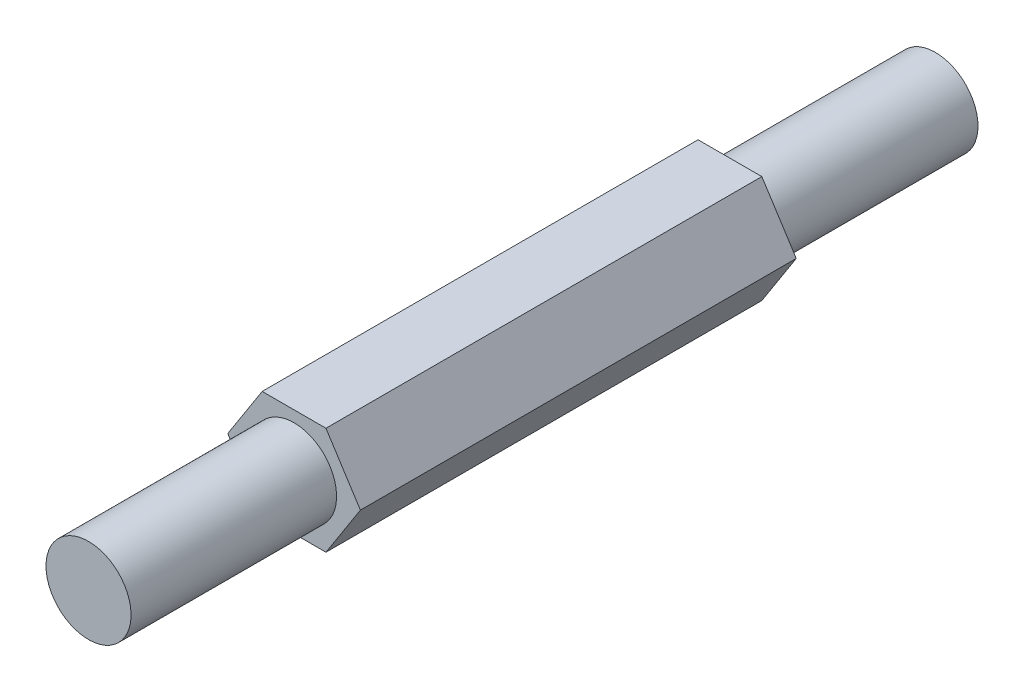
ISO-10303-21;
HEADER;
FILE_DESCRIPTION(('STEP AP214'),'2;1');
FILE_NAME('part.step','',(''),(''),'','','');
FILE_SCHEMA(('AUTOMOTIVE_DESIGN { 1 0 10303 214 1 1 1 1 }'));
ENDSEC;
DATA;
#1=APPLICATION_CONTEXT('core data for automotive mechanical design processes');
#2=APPLICATION_PROTOCOL_DEFINITION('international standard','automotive_design',2000,#1);
#3=PRODUCT_CONTEXT('',#1,'mechanical');
#4=PRODUCT('Part','Part','',(#3));
#5=PRODUCT_RELATED_PRODUCT_CATEGORY('part','',(#4));
#6=PRODUCT_DEFINITION_FORMATION('','',#4);
#7=PRODUCT_DEFINITION_CONTEXT('part definition',#1,'design');
#8=PRODUCT_DEFINITION('design','',#6,#7);
#9=PRODUCT_DEFINITION_SHAPE('','',#8);
#10=(LENGTH_UNIT() NAMED_UNIT(*) SI_UNIT(.MILLI.,.METRE.));
#11=(NAMED_UNIT(*) PLANE_ANGLE_UNIT() SI_UNIT($,.RADIAN.));
#12=(NAMED_UNIT(*) SI_UNIT($,.STERADIAN.) SOLID_ANGLE_UNIT());
#13=UNCERTAINTY_MEASURE_WITH_UNIT(LENGTH_MEASURE(1.E-05),#10,'distance_accuracy_value','');
#14=(GEOMETRIC_REPRESENTATION_CONTEXT(3) GLOBAL_UNCERTAINTY_ASSIGNED_CONTEXT((#13)) GLOBAL_UNIT_ASSIGNED_CONTEXT((#10,
#11,#12)) REPRESENTATION_CONTEXT('',''));
#15=CARTESIAN_POINT('',(0.,0.,0.));
#16=DIRECTION('',(0.,0.,1.));
#17=DIRECTION('',(1.,0.,0.));
#18=AXIS2_PLACEMENT_3D('',#15,#16,#17);
#19=CARTESIAN_POINT('',(-18.7143456592721,0.,123.));
#20=DIRECTION('',(0.841866475022014,-0.539685869959562,0.));
#21=DIRECTION('',(0.539685869959562,0.841866475022014,0.));
#22=AXIS2_PLACEMENT_3D('',#19,#20,#21);
#23=PLANE('',#22);
#24=DIRECTION('',(-0.539685869959562,-0.841866475022014,0.));
#25=VECTOR('',#24,1.);
#26=CARTESIAN_POINT('',(-18.7143456592721,0.,0.));
#27=LINE('',#26,#25);
#28=CARTESIAN_POINT('',(-9.,15.1535965503962,0.));
#29=VERTEX_POINT('',#28);
#30=CARTESIAN_POINT('',(-18.7143456592721,0.,0.));
#31=VERTEX_POINT('',#30);
#32=EDGE_CURVE('E137',#29,#31,#27,.T.);
#33=ORIENTED_EDGE('',*,*,#32,.T.);
#34=DIRECTION('',(0.,0.,-1.));
#35=VECTOR('',#34,1.);
#36=CARTESIAN_POINT('',(-18.7143456592721,0.,123.));
#37=LINE('',#36,#35);
#38=CARTESIAN_POINT('',(-18.7143456592721,0.,123.));
#39=VERTEX_POINT('',#38);
#40=EDGE_CURVE('E48',#39,#31,#37,.T.);
#41=ORIENTED_EDGE('',*,*,#40,.F.);
#42=DIRECTION('',(-0.539685869959562,-0.841866475022014,0.));
#43=VECTOR('',#42,1.);
#44=CARTESIAN_POINT('',(-18.7143456592721,0.,123.));
#45=LINE('',#44,#43);
#46=CARTESIAN_POINT('',(-9.,15.1535965503962,123.));
#47=VERTEX_POINT('',#46);
#48=EDGE_CURVE('E154',#47,#39,#45,.T.);
#49=ORIENTED_EDGE('',*,*,#48,.F.);
#50=DIRECTION('',(0.,0.,-1.));
#51=VECTOR('',#50,1.);
#52=CARTESIAN_POINT('',(-9.,15.1535965503962,123.));
#53=LINE('',#52,#51);
#54=EDGE_CURVE('E133',#47,#29,#53,.T.);
#55=ORIENTED_EDGE('',*,*,#54,.T.);
#56=EDGE_LOOP('',(#33,#41,#49,#55));
#57=FACE_BOUND('',#56,.T.);
#58=ADVANCED_FACE('F45',(#57),#23,.F.);
#59=CARTESIAN_POINT('',(-9.00000000000001,-15.1535965503963,123.));
#60=DIRECTION('',(0.841866475022014,0.539685869959561,0.));
#61=DIRECTION('',(-0.539685869959561,0.841866475022014,0.));
#62=AXIS2_PLACEMENT_3D('',#59,#60,#61);
#63=PLANE('',#62);
#64=DIRECTION('',(0.539685869959561,-0.841866475022014,0.));
#65=VECTOR('',#64,1.);
#66=CARTESIAN_POINT('',(-9.00000000000001,-15.1535965503963,0.));
#67=LINE('',#66,#65);
#68=CARTESIAN_POINT('',(-9.00000000000001,-15.1535965503963,0.));
#69=VERTEX_POINT('',#68);
#70=EDGE_CURVE('E141',#31,#69,#67,.T.);
#71=ORIENTED_EDGE('',*,*,#70,.T.);
#72=DIRECTION('',(0.,0.,-1.));
#73=VECTOR('',#72,1.);
#74=CARTESIAN_POINT('',(-9.00000000000001,-15.1535965503963,123.));
#75=LINE('',#74,#73);
#76=CARTESIAN_POINT('',(-9.00000000000001,-15.1535965503963,123.));
#77=VERTEX_POINT('',#76);
#78=EDGE_CURVE('E160',#77,#69,#75,.T.);
#79=ORIENTED_EDGE('',*,*,#78,.F.);
#80=DIRECTION('',(0.539685869959561,-0.841866475022014,0.));
#81=VECTOR('',#80,1.);
#82=CARTESIAN_POINT('',(-9.00000000000001,-15.1535965503963,123.));
#83=LINE('',#82,#81);
#84=EDGE_CURVE('E102',#39,#77,#83,.T.);
#85=ORIENTED_EDGE('',*,*,#84,.F.);
#86=ORIENTED_EDGE('',*,*,#40,.T.);
#87=EDGE_LOOP('',(#71,#79,#85,#86));
#88=FACE_BOUND('',#87,.T.);
#89=ADVANCED_FACE('F210',(#88),#63,.F.);
#90=CARTESIAN_POINT('',(8.99999999999999,-15.1535965503963,123.));
#91=DIRECTION('',(0.,1.,0.));
#92=DIRECTION('',(0.,0.,1.));
#93=AXIS2_PLACEMENT_3D('',#90,#91,#92);
#94=PLANE('',#93);
#95=DIRECTION('',(1.,0.,0.));
#96=VECTOR('',#95,1.);
#97=CARTESIAN_POINT('',(8.99999999999999,-15.1535965503963,0.));
#98=LINE('',#97,#96);
#99=CARTESIAN_POINT('',(8.99999999999999,-15.1535965503963,0.));
#100=VERTEX_POINT('',#99);
#101=EDGE_CURVE('E145',#69,#100,#98,.T.);
#102=ORIENTED_EDGE('',*,*,#101,.T.);
#103=DIRECTION('',(0.,0.,-1.));
#104=VECTOR('',#103,1.);
#105=CARTESIAN_POINT('',(8.99999999999999,-15.1535965503963,123.));
#106=LINE('',#105,#104);
#107=CARTESIAN_POINT('',(8.99999999999999,-15.1535965503963,123.));
#108=VERTEX_POINT('',#107);
#109=EDGE_CURVE('E126',#108,#100,#106,.T.);
#110=ORIENTED_EDGE('',*,*,#109,.F.);
#111=DIRECTION('',(1.,0.,0.));
#112=VECTOR('',#111,1.);
#113=CARTESIAN_POINT('',(8.99999999999999,-15.1535965503963,123.));
#114=LINE('',#113,#112);
#115=EDGE_CURVE('E115',#77,#108,#114,.T.);
#116=ORIENTED_EDGE('',*,*,#115,.F.);
#117=ORIENTED_EDGE('',*,*,#78,.T.);
#118=EDGE_LOOP('',(#102,#110,#116,#117));
#119=FACE_BOUND('',#118,.T.);
#120=ADVANCED_FACE('F215',(#119),#94,.F.);
#121=CARTESIAN_POINT('',(18.7143456592721,0.,123.));
#122=DIRECTION('',(-0.841866475022014,0.539685869959562,0.));
#123=DIRECTION('',(-0.539685869959562,-0.841866475022014,0.));
#124=AXIS2_PLACEMENT_3D('',#121,#122,#123);
#125=PLANE('',#124);
#126=DIRECTION('',(0.539685869959562,0.841866475022014,0.));
#127=VECTOR('',#126,1.);
#128=CARTESIAN_POINT('',(18.7143456592721,0.,0.));
#129=LINE('',#128,#127);
#130=CARTESIAN_POINT('',(18.7143456592721,0.,0.));
#131=VERTEX_POINT('',#130);
#132=EDGE_CURVE('E124',#100,#131,#129,.T.);
#133=ORIENTED_EDGE('',*,*,#132,.T.);
#134=DIRECTION('',(0.,0.,-1.));
#135=VECTOR('',#134,1.);
#136=CARTESIAN_POINT('',(18.7143456592721,0.,123.));
#137=LINE('',#136,#135);
#138=CARTESIAN_POINT('',(18.7143456592721,0.,123.));
#139=VERTEX_POINT('',#138);
#140=EDGE_CURVE('E121',#139,#131,#137,.T.);
#141=ORIENTED_EDGE('',*,*,#140,.F.);
#142=DIRECTION('',(0.539685869959562,0.841866475022014,0.));
#143=VECTOR('',#142,1.);
#144=CARTESIAN_POINT('',(18.7143456592721,0.,123.));
#145=LINE('',#144,#143);
#146=EDGE_CURVE('E109',#108,#139,#145,.T.);
#147=ORIENTED_EDGE('',*,*,#146,.F.);
#148=ORIENTED_EDGE('',*,*,#109,.T.);
#149=EDGE_LOOP('',(#133,#141,#147,#148));
#150=FACE_BOUND('',#149,.T.);
#151=ADVANCED_FACE('F122',(#150),#125,.F.);
#152=CARTESIAN_POINT('',(9.,15.1535965503963,123.));
#153=DIRECTION('',(-0.841866475022014,-0.539685869959561,0.));
#154=DIRECTION('',(0.539685869959561,-0.841866475022014,0.));
#155=AXIS2_PLACEMENT_3D('',#152,#153,#154);
#156=PLANE('',#155);
#157=DIRECTION('',(-0.539685869959561,0.841866475022014,0.));
#158=VECTOR('',#157,1.);
#159=CARTESIAN_POINT('',(9.,15.1535965503963,0.));
#160=LINE('',#159,#158);
#161=CARTESIAN_POINT('',(9.,15.1535965503963,0.));
#162=VERTEX_POINT('',#161);
#163=EDGE_CURVE('E87',#131,#162,#160,.T.);
#164=ORIENTED_EDGE('',*,*,#163,.T.);
#165=DIRECTION('',(0.,0.,-1.));
#166=VECTOR('',#165,1.);
#167=CARTESIAN_POINT('',(9.,15.1535965503963,123.));
#168=LINE('',#167,#166);
#169=CARTESIAN_POINT('',(9.,15.1535965503963,123.));
#170=VERTEX_POINT('',#169);
#171=EDGE_CURVE('E127',#170,#162,#168,.T.);
#172=ORIENTED_EDGE('',*,*,#171,.F.);
#173=DIRECTION('',(-0.539685869959561,0.841866475022014,0.));
#174=VECTOR('',#173,1.);
#175=CARTESIAN_POINT('',(9.,15.1535965503963,123.));
#176=LINE('',#175,#174);
#177=EDGE_CURVE('E113',#139,#170,#176,.T.);
#178=ORIENTED_EDGE('',*,*,#177,.F.);
#179=ORIENTED_EDGE('',*,*,#140,.T.);
#180=EDGE_LOOP('',(#164,#172,#178,#179));
#181=FACE_BOUND('',#180,.T.);
#182=ADVANCED_FACE('F129',(#181),#156,.F.);
#183=CARTESIAN_POINT('',(-9.,15.1535965503962,123.));
#184=DIRECTION('',(0.,-1.,0.));
#185=DIRECTION('',(1.,0.,0.));
#186=AXIS2_PLACEMENT_3D('',#183,#184,#185);
#187=PLANE('',#186);
#188=DIRECTION('',(-1.,0.,0.));
#189=VECTOR('',#188,1.);
#190=CARTESIAN_POINT('',(-9.,15.1535965503962,0.));
#191=LINE('',#190,#189);
#192=EDGE_CURVE('E93',#162,#29,#191,.T.);
#193=ORIENTED_EDGE('',*,*,#192,.T.);
#194=ORIENTED_EDGE('',*,*,#54,.F.);
#195=DIRECTION('',(-1.,0.,0.));
#196=VECTOR('',#195,1.);
#197=CARTESIAN_POINT('',(-9.,15.1535965503962,123.));
#198=LINE('',#197,#196);
#199=EDGE_CURVE('E64',#170,#47,#198,.T.);
#200=ORIENTED_EDGE('',*,*,#199,.F.);
#201=ORIENTED_EDGE('',*,*,#171,.T.);
#202=EDGE_LOOP('',(#193,#194,#200,#201));
#203=FACE_BOUND('',#202,.T.);
#204=ADVANCED_FACE('F197',(#203),#187,.F.);
#205=CARTESIAN_POINT('',(0.,0.,123.));
#206=DIRECTION('',(0.,0.,-1.));
#207=DIRECTION('',(-1.,0.,0.));
#208=AXIS2_PLACEMENT_3D('',#205,#206,#207);
#209=PLANE('',#208);
#210=CARTESIAN_POINT('',(0.,0.,123.));
#211=DIRECTION('',(0.,0.,1.));
#212=DIRECTION('',(1.,0.,0.));
#213=AXIS2_PLACEMENT_3D('',#210,#211,#212);
#214=CIRCLE('',#213,12.);
#215=CARTESIAN_POINT('',(-12.,0.,123.));
#216=VERTEX_POINT('',#215);
#217=EDGE_CURVE('E11',#216,#216,#214,.T.);
#218=ORIENTED_EDGE('',*,*,#217,.F.);
#219=EDGE_LOOP('',(#218));
#220=FACE_BOUND('',#219,.T.);
#221=ORIENTED_EDGE('',*,*,#48,.T.);
#222=ORIENTED_EDGE('',*,*,#84,.T.);
#223=ORIENTED_EDGE('',*,*,#115,.T.);
#224=ORIENTED_EDGE('',*,*,#146,.T.);
#225=ORIENTED_EDGE('',*,*,#177,.T.);
#226=ORIENTED_EDGE('',*,*,#199,.T.);
#227=EDGE_LOOP('',(#221,#222,#223,#224,#225,#226));
#228=FACE_BOUND('',#227,.T.);
#229=ADVANCED_FACE('F111',(#220,#228),#209,.F.);
#230=CARTESIAN_POINT('',(0.,0.,0.));
#231=DIRECTION('',(0.,0.,-1.));
#232=DIRECTION('',(-1.,0.,0.));
#233=AXIS2_PLACEMENT_3D('',#230,#231,#232);
#234=PLANE('',#233);
#235=CARTESIAN_POINT('',(0.,0.,0.));
#236=DIRECTION('',(0.,0.,-1.));
#237=DIRECTION('',(-1.,0.,0.));
#238=AXIS2_PLACEMENT_3D('',#235,#236,#237);
#239=CIRCLE('',#238,12.);
#240=CARTESIAN_POINT('',(12.,0.,0.));
#241=VERTEX_POINT('',#240);
#242=EDGE_CURVE('E55',#241,#241,#239,.T.);
#243=ORIENTED_EDGE('',*,*,#242,.F.);
#244=EDGE_LOOP('',(#243));
#245=FACE_BOUND('',#244,.T.);
#246=ORIENTED_EDGE('',*,*,#32,.F.);
#247=ORIENTED_EDGE('',*,*,#192,.F.);
#248=ORIENTED_EDGE('',*,*,#163,.F.);
#249=ORIENTED_EDGE('',*,*,#132,.F.);
#250=ORIENTED_EDGE('',*,*,#101,.F.);
#251=ORIENTED_EDGE('',*,*,#70,.F.);
#252=EDGE_LOOP('',(#246,#247,#248,#249,#250,#251));
#253=FACE_BOUND('',#252,.T.);
#254=ADVANCED_FACE('F196',(#245,#253),#234,.T.);
#255=CARTESIAN_POINT('',(0.,0.,-58.));
#256=DIRECTION('',(0.,0.,1.));
#257=DIRECTION('',(1.,0.,0.));
#258=AXIS2_PLACEMENT_3D('',#255,#256,#257);
#259=CYLINDRICAL_SURFACE('',#258,12.);
#260=CARTESIAN_POINT('',(0.,0.,-58.));
#261=DIRECTION('',(0.,0.,-1.));
#262=DIRECTION('',(-1.,0.,0.));
#263=AXIS2_PLACEMENT_3D('',#260,#261,#262);
#264=CIRCLE('',#263,12.);
#265=CARTESIAN_POINT('',(12.,0.,-58.));
#266=VERTEX_POINT('',#265);
#267=EDGE_CURVE('E142',#266,#266,#264,.T.);
#268=CARTESIAN_POINT('',(12.,0.,-58.));
#269=CARTESIAN_POINT('',(12.,0.,-57.3958333333333));
#270=CARTESIAN_POINT('',(12.,0.,-56.7916666666667));
#271=CARTESIAN_POINT('',(12.,0.,-55.5833333333333));
#272=CARTESIAN_POINT('',(12.,0.,-54.9791666666667));
#273=CARTESIAN_POINT('',(12.,0.,-53.7708333333333));
#274=CARTESIAN_POINT('',(12.,0.,-53.1666666666667));
#275=CARTESIAN_POINT('',(12.,0.,-51.9583333333333));
#276=CARTESIAN_POINT('',(12.,0.,-51.3541666666667));
#277=CARTESIAN_POINT('',(12.,0.,-50.1458333333333));
#278=CARTESIAN_POINT('',(12.,0.,-49.5416666666667));
#279=CARTESIAN_POINT('',(12.,0.,-48.3333333333333));
#280=CARTESIAN_POINT('',(12.,0.,-47.7291666666667));
#281=CARTESIAN_POINT('',(12.,0.,-46.5208333333333));
#282=CARTESIAN_POINT('',(12.,0.,-45.9166666666667));
#283=CARTESIAN_POINT('',(12.,0.,-44.7083333333333));
#284=CARTESIAN_POINT('',(12.,0.,-44.1041666666667));
#285=CARTESIAN_POINT('',(12.,0.,-42.8958333333333));
#286=CARTESIAN_POINT('',(12.,0.,-42.2916666666667));
#287=CARTESIAN_POINT('',(12.,0.,-41.0833333333333));
#288=CARTESIAN_POINT('',(12.,0.,-40.4791666666667));
#289=CARTESIAN_POINT('',(12.,0.,-39.2708333333333));
#290=CARTESIAN_POINT('',(12.,0.,-38.6666666666667));
#291=CARTESIAN_POINT('',(12.,0.,-37.4583333333333));
#292=CARTESIAN_POINT('',(12.,0.,-36.8541666666667));
#293=CARTESIAN_POINT('',(12.,0.,-35.6458333333333));
#294=CARTESIAN_POINT('',(12.,0.,-35.0416666666667));
#295=CARTESIAN_POINT('',(12.,0.,-33.8333333333333));
#296=CARTESIAN_POINT('',(12.,0.,-33.2291666666667));
#297=CARTESIAN_POINT('',(12.,0.,-32.0208333333333));
#298=CARTESIAN_POINT('',(12.,0.,-31.4166666666667));
#299=CARTESIAN_POINT('',(12.,0.,-30.2083333333333));
#300=CARTESIAN_POINT('',(12.,0.,-29.6041666666667));
#301=CARTESIAN_POINT('',(12.,0.,-28.3958333333333));
#302=CARTESIAN_POINT('',(12.,0.,-27.7916666666667));
#303=CARTESIAN_POINT('',(12.,0.,-26.5833333333333));
#304=CARTESIAN_POINT('',(12.,0.,-25.9791666666667));
#305=CARTESIAN_POINT('',(12.,0.,-24.7708333333333));
#306=CARTESIAN_POINT('',(12.,0.,-24.1666666666667));
#307=CARTESIAN_POINT('',(12.,0.,-22.9583333333333));
#308=CARTESIAN_POINT('',(12.,0.,-22.3541666666667));
#309=CARTESIAN_POINT('',(12.,0.,-21.1458333333333));
#310=CARTESIAN_POINT('',(12.,0.,-20.5416666666667));
#311=CARTESIAN_POINT('',(12.,0.,-19.3333333333333));
#312=CARTESIAN_POINT('',(12.,0.,-18.7291666666667));
#313=CARTESIAN_POINT('',(12.,0.,-17.5208333333333));
#314=CARTESIAN_POINT('',(12.,0.,-16.9166666666667));
#315=CARTESIAN_POINT('',(12.,0.,-15.7083333333333));
#316=CARTESIAN_POINT('',(12.,0.,-15.1041666666667));
#317=CARTESIAN_POINT('',(12.,0.,-13.8958333333333));
#318=CARTESIAN_POINT('',(12.,0.,-13.2916666666667));
#319=CARTESIAN_POINT('',(12.,0.,-12.0833333333333));
#320=CARTESIAN_POINT('',(12.,0.,-11.4791666666667));
#321=CARTESIAN_POINT('',(12.,0.,-10.2708333333333));
#322=CARTESIAN_POINT('',(12.,0.,-9.66666666666667));
#323=CARTESIAN_POINT('',(12.,0.,-8.45833333333333));
#324=CARTESIAN_POINT('',(12.,0.,-7.85416666666667));
#325=CARTESIAN_POINT('',(12.,0.,-6.64583333333333));
#326=CARTESIAN_POINT('',(12.,0.,-6.04166666666667));
#327=CARTESIAN_POINT('',(12.,0.,-4.83333333333333));
#328=CARTESIAN_POINT('',(12.,0.,-4.22916666666667));
#329=CARTESIAN_POINT('',(12.,0.,-3.02083333333334));
#330=CARTESIAN_POINT('',(12.,0.,-2.41666666666667));
#331=CARTESIAN_POINT('',(12.,0.,-1.20833333333333));
#332=CARTESIAN_POINT('',(12.,0.,-0.604166666666666));
#333=CARTESIAN_POINT('',(12.,0.,0.));
#334=B_SPLINE_CURVE_WITH_KNOTS('',3,(#268,#269,#270,#271,#272,#273,#274,#275,#276,#277,#278,
#279,#280,#281,#282,#283,#284,#285,#286,#287,#288,#289,#290,#291,#292,#293,#294,#295,#296,#297,
#298,#299,#300,#301,#302,#303,#304,#305,#306,#307,#308,#309,#310,#311,#312,#313,#314,#315,#316,
#317,#318,#319,#320,#321,#322,#323,#324,#325,#326,#327,#328,#329,#330,#331,#332,#333),
.UNSPECIFIED.,.F.,.F.,(4,2,2,2,2,2,2,2,2,2,2,2,2,2,2,2,2,2,2,2,2,2,2,2,2,2,2,2,2,2,2,2,4),(0.,
1.8125,3.625,5.4375,7.25000000000001,9.0625,10.875,12.6875,14.5,16.3125,18.125,19.9375,21.75,
23.5625,25.375,27.1875,29.,30.8125,32.625,34.4375,36.25,38.0625,39.875,41.6875,43.5,45.3125,
47.125,48.9375,50.75,52.5625,54.375,56.1875,58.),.UNSPECIFIED.);
#335=EDGE_CURVE('BSEAM203',#266,#241,#334,.T.);
#336=ORIENTED_EDGE('',*,*,#267,.F.);
#337=ORIENTED_EDGE('',*,*,#242,.T.);
#338=ORIENTED_EDGE('',*,*,#335,.T.);
#339=ORIENTED_EDGE('',*,*,#335,.F.);
#340=EDGE_LOOP('',(#336,#338,#337,#339));
#341=FACE_BOUND('',#340,.T.);
#342=ADVANCED_FACE('F203',(#341),#259,.T.);
#343=CARTESIAN_POINT('',(0.,0.,-58.));
#344=DIRECTION('',(0.,0.,-1.));
#345=DIRECTION('',(-1.,0.,0.));
#346=AXIS2_PLACEMENT_3D('',#343,#344,#345);
#347=PLANE('',#346);
#348=ORIENTED_EDGE('',*,*,#267,.T.);
#349=EDGE_LOOP('',(#348));
#350=FACE_BOUND('',#349,.T.);
#351=ADVANCED_FACE('F191',(#350),#347,.T.);
#352=CARTESIAN_POINT('',(0.,0.,181.));
#353=DIRECTION('',(0.,0.,-1.));
#354=DIRECTION('',(-1.,0.,0.));
#355=AXIS2_PLACEMENT_3D('',#352,#353,#354);
#356=CYLINDRICAL_SURFACE('',#355,12.);
#357=CARTESIAN_POINT('',(0.,0.,181.));
#358=DIRECTION('',(0.,0.,1.));
#359=DIRECTION('',(1.,0.,0.));
#360=AXIS2_PLACEMENT_3D('',#357,#358,#359);
#361=CIRCLE('',#360,12.);
#362=CARTESIAN_POINT('',(-12.,0.,181.));
#363=VERTEX_POINT('',#362);
#364=EDGE_CURVE('E181',#363,#363,#361,.T.);
#365=CARTESIAN_POINT('',(-12.,0.,181.));
#366=CARTESIAN_POINT('',(-12.,0.,180.395833333333));
#367=CARTESIAN_POINT('',(-12.,0.,179.791666666667));
#368=CARTESIAN_POINT('',(-12.,0.,178.583333333333));
#369=CARTESIAN_POINT('',(-12.,0.,177.979166666667));
#370=CARTESIAN_POINT('',(-12.,0.,176.770833333333));
#371=CARTESIAN_POINT('',(-12.,0.,176.166666666667));
#372=CARTESIAN_POINT('',(-12.,0.,174.958333333333));
#373=CARTESIAN_POINT('',(-12.,0.,174.354166666667));
#374=CARTESIAN_POINT('',(-12.,0.,173.145833333333));
#375=CARTESIAN_POINT('',(-12.,0.,172.541666666667));
#376=CARTESIAN_POINT('',(-12.,0.,171.333333333333));
#377=CARTESIAN_POINT('',(-12.,0.,170.729166666667));
#378=CARTESIAN_POINT('',(-12.,0.,169.520833333333));
#379=CARTESIAN_POINT('',(-12.,0.,168.916666666667));
#380=CARTESIAN_POINT('',(-12.,0.,167.708333333333));
#381=CARTESIAN_POINT('',(-12.,0.,167.104166666667));
#382=CARTESIAN_POINT('',(-12.,0.,165.895833333333));
#383=CARTESIAN_POINT('',(-12.,0.,165.291666666667));
#384=CARTESIAN_POINT('',(-12.,0.,164.083333333333));
#385=CARTESIAN_POINT('',(-12.,0.,163.479166666667));
#386=CARTESIAN_POINT('',(-12.,0.,162.270833333333));
#387=CARTESIAN_POINT('',(-12.,0.,161.666666666667));
#388=CARTESIAN_POINT('',(-12.,0.,160.458333333333));
#389=CARTESIAN_POINT('',(-12.,0.,159.854166666667));
#390=CARTESIAN_POINT('',(-12.,0.,158.645833333333));
#391=CARTESIAN_POINT('',(-12.,0.,158.041666666667));
#392=CARTESIAN_POINT('',(-12.,0.,156.833333333333));
#393=CARTESIAN_POINT('',(-12.,0.,156.229166666667));
#394=CARTESIAN_POINT('',(-12.,0.,155.020833333333));
#395=CARTESIAN_POINT('',(-12.,0.,154.416666666667));
#396=CARTESIAN_POINT('',(-12.,0.,153.208333333333));
#397=CARTESIAN_POINT('',(-12.,0.,152.604166666667));
#398=CARTESIAN_POINT('',(-12.,0.,151.395833333333));
#399=CARTESIAN_POINT('',(-12.,0.,150.791666666667));
#400=CARTESIAN_POINT('',(-12.,0.,149.583333333333));
#401=CARTESIAN_POINT('',(-12.,0.,148.979166666667));
#402=CARTESIAN_POINT('',(-12.,0.,147.770833333333));
#403=CARTESIAN_POINT('',(-12.,0.,147.166666666667));
#404=CARTESIAN_POINT('',(-12.,0.,145.958333333333));
#405=CARTESIAN_POINT('',(-12.,0.,145.354166666667));
#406=CARTESIAN_POINT('',(-12.,0.,144.145833333333));
#407=CARTESIAN_POINT('',(-12.,0.,143.541666666667));
#408=CARTESIAN_POINT('',(-12.,0.,142.333333333333));
#409=CARTESIAN_POINT('',(-12.,0.,141.729166666667));
#410=CARTESIAN_POINT('',(-12.,0.,140.520833333333));
#411=CARTESIAN_POINT('',(-12.,0.,139.916666666667));
#412=CARTESIAN_POINT('',(-12.,0.,138.708333333333));
#413=CARTESIAN_POINT('',(-12.,0.,138.104166666667));
#414=CARTESIAN_POINT('',(-12.,0.,136.895833333333));
#415=CARTESIAN_POINT('',(-12.,0.,136.291666666667));
#416=CARTESIAN_POINT('',(-12.,0.,135.083333333333));
#417=CARTESIAN_POINT('',(-12.,0.,134.479166666667));
#418=CARTESIAN_POINT('',(-12.,0.,133.270833333333));
#419=CARTESIAN_POINT('',(-12.,0.,132.666666666667));
#420=CARTESIAN_POINT('',(-12.,0.,131.458333333333));
#421=CARTESIAN_POINT('',(-12.,0.,130.854166666667));
#422=CARTESIAN_POINT('',(-12.,0.,129.645833333333));
#423=CARTESIAN_POINT('',(-12.,0.,129.041666666667));
#424=CARTESIAN_POINT('',(-12.,0.,127.833333333333));
#425=CARTESIAN_POINT('',(-12.,0.,127.229166666667));
#426=CARTESIAN_POINT('',(-12.,0.,126.020833333333));
#427=CARTESIAN_POINT('',(-12.,0.,125.416666666667));
#428=CARTESIAN_POINT('',(-12.,0.,124.208333333333));
#429=CARTESIAN_POINT('',(-12.,0.,123.604166666667));
#430=CARTESIAN_POINT('',(-12.,0.,123.));
#431=B_SPLINE_CURVE_WITH_KNOTS('',3,(#365,#366,#367,#368,#369,#370,#371,#372,#373,#374,#375,
#376,#377,#378,#379,#380,#381,#382,#383,#384,#385,#386,#387,#388,#389,#390,#391,#392,#393,#394,
#395,#396,#397,#398,#399,#400,#401,#402,#403,#404,#405,#406,#407,#408,#409,#410,#411,#412,#413,
#414,#415,#416,#417,#418,#419,#420,#421,#422,#423,#424,#425,#426,#427,#428,#429,#430),
.UNSPECIFIED.,.F.,.F.,(4,2,2,2,2,2,2,2,2,2,2,2,2,2,2,2,2,2,2,2,2,2,2,2,2,2,2,2,2,2,2,2,4),(0.,
1.81250000000002,3.62500000000002,5.43750000000001,7.25000000000001,9.0625,10.875,12.6875,14.5,
16.3125,18.125,19.9375,21.75,23.5625,25.375,27.1875,29.,30.8125,32.625,34.4375,36.25,38.0625,
39.875,41.6875,43.5,45.3125,47.125,48.9375,50.75,52.5625,54.375,56.1875,58.),.UNSPECIFIED.);
#432=EDGE_CURVE('BSEAM188',#363,#216,#431,.T.);
#433=ORIENTED_EDGE('',*,*,#364,.F.);
#434=ORIENTED_EDGE('',*,*,#217,.T.);
#435=ORIENTED_EDGE('',*,*,#432,.T.);
#436=ORIENTED_EDGE('',*,*,#432,.F.);
#437=EDGE_LOOP('',(#433,#435,#434,#436));
#438=FACE_BOUND('',#437,.T.);
#439=ADVANCED_FACE('F188',(#438),#356,.T.);
#440=CARTESIAN_POINT('',(0.,0.,181.));
#441=DIRECTION('',(0.,0.,1.));
#442=DIRECTION('',(1.,0.,0.));
#443=AXIS2_PLACEMENT_3D('',#440,#441,#442);
#444=PLANE('',#443);
#445=ORIENTED_EDGE('',*,*,#364,.T.);
#446=EDGE_LOOP('',(#445));
#447=FACE_BOUND('',#446,.T.);
#448=ADVANCED_FACE('F186',(#447),#444,.T.);
#449=CLOSED_SHELL('',(#58,#89,#120,#151,#182,#204,#229,#254,#342,#351,#439,#448));
#450=MANIFOLD_SOLID_BREP('B2',#449);
#451=ADVANCED_BREP_SHAPE_REPRESENTATION('',(#18,#450),#14);
#452=SHAPE_DEFINITION_REPRESENTATION(#9,#451);
ENDSEC;
END-ISO-10303-21;
